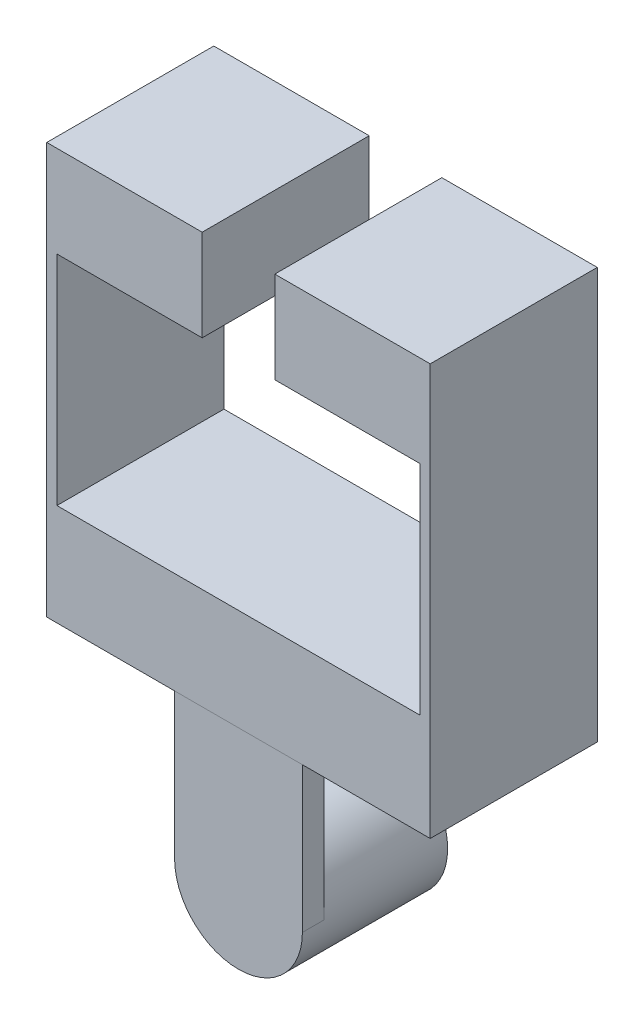
ISO-10303-21;
HEADER;
FILE_DESCRIPTION(('STEP AP214'),'2;1');
FILE_NAME('part.step','',(''),(''),'','','');
FILE_SCHEMA(('AUTOMOTIVE_DESIGN { 1 0 10303 214 1 1 1 1 }'));
ENDSEC;
DATA;
#1=APPLICATION_CONTEXT('core data for automotive mechanical design processes');
#2=APPLICATION_PROTOCOL_DEFINITION('international standard','automotive_design',2000,#1);
#3=PRODUCT_CONTEXT('',#1,'mechanical');
#4=PRODUCT('Part','Part','',(#3));
#5=PRODUCT_RELATED_PRODUCT_CATEGORY('part','',(#4));
#6=PRODUCT_DEFINITION_FORMATION('','',#4);
#7=PRODUCT_DEFINITION_CONTEXT('part definition',#1,'design');
#8=PRODUCT_DEFINITION('design','',#6,#7);
#9=PRODUCT_DEFINITION_SHAPE('','',#8);
#10=(LENGTH_UNIT() NAMED_UNIT(*) SI_UNIT(.MILLI.,.METRE.));
#11=(NAMED_UNIT(*) PLANE_ANGLE_UNIT() SI_UNIT($,.RADIAN.));
#12=(NAMED_UNIT(*) SI_UNIT($,.STERADIAN.) SOLID_ANGLE_UNIT());
#13=UNCERTAINTY_MEASURE_WITH_UNIT(LENGTH_MEASURE(1.E-05),#10,'distance_accuracy_value','');
#14=(GEOMETRIC_REPRESENTATION_CONTEXT(3) GLOBAL_UNCERTAINTY_ASSIGNED_CONTEXT((#13)) GLOBAL_UNIT_ASSIGNED_CONTEXT((#10,
#11,#12)) REPRESENTATION_CONTEXT('',''));
#15=CARTESIAN_POINT('',(0.,0.,0.));
#16=DIRECTION('',(0.,0.,1.));
#17=DIRECTION('',(1.,0.,0.));
#18=AXIS2_PLACEMENT_3D('',#15,#16,#17);
#19=CARTESIAN_POINT('',(0.,0.,29.21));
#20=DIRECTION('',(0.,0.,-1.));
#21=DIRECTION('',(-1.,0.,0.));
#22=AXIS2_PLACEMENT_3D('',#19,#20,#21);
#23=PLANE('',#22);
#24=DIRECTION('',(1.,0.,0.));
#25=VECTOR('',#24,1.);
#26=CARTESIAN_POINT('',(0.,-17.9340596383422,29.21));
#27=LINE('',#26,#25);
#28=CARTESIAN_POINT('',(-29.5693170731707,-17.9340596383422,29.21));
#29=VERTEX_POINT('',#28);
#30=CARTESIAN_POINT('',(-7.21731707317072,-17.9340596383422,29.21));
#31=VERTEX_POINT('',#30);
#32=EDGE_CURVE('E11',#29,#31,#27,.T.);
#33=ORIENTED_EDGE('',*,*,#32,.F.);
#34=DIRECTION('',(0.,-1.,0.));
#35=VECTOR('',#34,1.);
#36=CARTESIAN_POINT('',(-29.5693170731707,-17.9340596383422,29.21));
#37=LINE('',#36,#35);
#38=CARTESIAN_POINT('',(-29.5693170731707,-43.3340596383422,29.21));
#39=VERTEX_POINT('',#38);
#40=EDGE_CURVE('E273',#29,#39,#37,.T.);
#41=ORIENTED_EDGE('',*,*,#40,.T.);
#42=CARTESIAN_POINT('',(-18.3933170731707,-43.3340596383422,29.21));
#43=DIRECTION('',(0.,0.,1.));
#44=DIRECTION('',(1.,0.,0.));
#45=AXIS2_PLACEMENT_3D('',#42,#43,#44);
#46=CIRCLE('',#45,11.176);
#47=CARTESIAN_POINT('',(-7.21731707317072,-43.3340596383422,29.21));
#48=VERTEX_POINT('',#47);
#49=EDGE_CURVE('E342',#39,#48,#46,.T.);
#50=ORIENTED_EDGE('',*,*,#49,.T.);
#51=DIRECTION('',(0.,1.,0.));
#52=VECTOR('',#51,1.);
#53=CARTESIAN_POINT('',(-7.21731707317072,-43.3340596383422,29.21));
#54=LINE('',#53,#52);
#55=EDGE_CURVE('E269',#48,#31,#54,.T.);
#56=ORIENTED_EDGE('',*,*,#55,.T.);
#57=EDGE_LOOP('',(#33,#41,#50,#56));
#58=FACE_BOUND('',#57,.T.);
#59=ADVANCED_FACE('F47',(#58),#23,.F.);
#60=CARTESIAN_POINT('',(-51.9213170731707,-17.9340596383422,29.21));
#61=DIRECTION('',(0.,1.,0.));
#62=DIRECTION('',(-1.,0.,0.));
#63=AXIS2_PLACEMENT_3D('',#60,#61,#62);
#64=PLANE('',#63);
#65=DIRECTION('',(0.,0.,1.));
#66=VECTOR('',#65,1.);
#67=CARTESIAN_POINT('',(-7.21731707317072,-17.9340596383422,25.4));
#68=LINE('',#67,#66);
#69=CARTESIAN_POINT('',(-7.21731707317072,-17.9340596383422,25.4));
#70=VERTEX_POINT('',#69);
#71=EDGE_CURVE('E191',#70,#31,#68,.T.);
#72=ORIENTED_EDGE('',*,*,#71,.F.);
#73=DIRECTION('',(-1.,0.,0.));
#74=VECTOR('',#73,1.);
#75=CARTESIAN_POINT('',(-7.21731707317072,-17.9340596383422,25.4));
#76=LINE('',#75,#74);
#77=CARTESIAN_POINT('',(-29.5693170731707,-17.9340596383422,25.4));
#78=VERTEX_POINT('',#77);
#79=EDGE_CURVE('E270',#70,#78,#76,.T.);
#80=ORIENTED_EDGE('',*,*,#79,.T.);
#81=DIRECTION('',(0.,0.,1.));
#82=VECTOR('',#81,1.);
#83=CARTESIAN_POINT('',(-29.5693170731707,-17.9340596383422,25.4));
#84=LINE('',#83,#82);
#85=EDGE_CURVE('E266',#78,#29,#84,.T.);
#86=ORIENTED_EDGE('',*,*,#85,.T.);
#87=DIRECTION('',(1.,0.,0.));
#88=VECTOR('',#87,1.);
#89=CARTESIAN_POINT('',(-51.9213170731707,-17.9340596383422,29.21));
#90=LINE('',#89,#88);
#91=CARTESIAN_POINT('',(-51.9213170731707,-17.9340596383422,29.21));
#92=VERTEX_POINT('',#91);
#93=EDGE_CURVE('E187',#92,#29,#90,.T.);
#94=ORIENTED_EDGE('',*,*,#93,.F.);
#95=DIRECTION('',(0.,0.,-1.));
#96=VECTOR('',#95,1.);
#97=CARTESIAN_POINT('',(-51.9213170731707,-17.9340596383422,29.21));
#98=LINE('',#97,#96);
#99=CARTESIAN_POINT('',(-51.9213170731707,-17.9340596383422,0.));
#100=VERTEX_POINT('',#99);
#101=EDGE_CURVE('E75',#92,#100,#98,.T.);
#102=ORIENTED_EDGE('',*,*,#101,.T.);
#103=DIRECTION('',(1.,0.,0.));
#104=VECTOR('',#103,1.);
#105=CARTESIAN_POINT('',(-51.9213170731707,-17.9340596383422,0.));
#106=LINE('',#105,#104);
#107=CARTESIAN_POINT('',(15.1346829268293,-17.9340596383422,0.));
#108=VERTEX_POINT('',#107);
#109=EDGE_CURVE('E218',#100,#108,#106,.T.);
#110=ORIENTED_EDGE('',*,*,#109,.T.);
#111=DIRECTION('',(0.,0.,-1.));
#112=VECTOR('',#111,1.);
#113=CARTESIAN_POINT('',(15.1346829268293,-17.9340596383422,29.21));
#114=LINE('',#113,#112);
#115=CARTESIAN_POINT('',(15.1346829268293,-17.9340596383422,29.21));
#116=VERTEX_POINT('',#115);
#117=EDGE_CURVE('E164',#116,#108,#114,.T.);
#118=ORIENTED_EDGE('',*,*,#117,.F.);
#119=EDGE_CURVE('E179',#31,#116,#90,.T.);
#120=ORIENTED_EDGE('',*,*,#119,.F.);
#121=EDGE_LOOP('',(#72,#80,#86,#94,#102,#110,#118,#120));
#122=FACE_BOUND('',#121,.T.);
#123=ADVANCED_FACE('F335',(#122),#64,.F.);
#124=CARTESIAN_POINT('',(-51.9213170731707,-17.9340596383422,29.21));
#125=DIRECTION('',(-1.,0.,0.));
#126=DIRECTION('',(0.,0.,1.));
#127=AXIS2_PLACEMENT_3D('',#124,#125,#126);
#128=PLANE('',#127);
#129=DIRECTION('',(0.,1.,0.));
#130=VECTOR('',#129,1.);
#131=CARTESIAN_POINT('',(-51.9213170731707,-17.9340596383422,0.));
#132=LINE('',#131,#130);
#133=CARTESIAN_POINT('',(-51.9213170731707,53.9479403616578,0.));
#134=VERTEX_POINT('',#133);
#135=EDGE_CURVE('E188',#100,#134,#132,.T.);
#136=ORIENTED_EDGE('',*,*,#135,.F.);
#137=ORIENTED_EDGE('',*,*,#101,.F.);
#138=DIRECTION('',(0.,1.,0.));
#139=VECTOR('',#138,1.);
#140=CARTESIAN_POINT('',(-51.9213170731707,-17.9340596383422,29.21));
#141=LINE('',#140,#139);
#142=CARTESIAN_POINT('',(-51.9213170731707,53.9479403616578,29.21));
#143=VERTEX_POINT('',#142);
#144=EDGE_CURVE('E222',#92,#143,#141,.T.);
#145=ORIENTED_EDGE('',*,*,#144,.T.);
#146=DIRECTION('',(0.,0.,-1.));
#147=VECTOR('',#146,1.);
#148=CARTESIAN_POINT('',(-51.9213170731707,53.9479403616578,29.21));
#149=LINE('',#148,#147);
#150=EDGE_CURVE('E125',#143,#134,#149,.T.);
#151=ORIENTED_EDGE('',*,*,#150,.T.);
#152=EDGE_LOOP('',(#136,#137,#145,#151));
#153=FACE_BOUND('',#152,.T.);
#154=ADVANCED_FACE('F51',(#153),#128,.T.);
#155=CARTESIAN_POINT('',(15.1346829268293,53.9479403616578,29.21));
#156=DIRECTION('',(1.,0.,0.));
#157=DIRECTION('',(0.,1.,0.));
#158=AXIS2_PLACEMENT_3D('',#155,#156,#157);
#159=PLANE('',#158);
#160=DIRECTION('',(0.,-1.,0.));
#161=VECTOR('',#160,1.);
#162=CARTESIAN_POINT('',(15.1346829268293,53.9479403616578,0.));
#163=LINE('',#162,#161);
#164=CARTESIAN_POINT('',(15.1346829268293,53.9479403616578,0.));
#165=VERTEX_POINT('',#164);
#166=EDGE_CURVE('E159',#165,#108,#163,.T.);
#167=ORIENTED_EDGE('',*,*,#166,.F.);
#168=DIRECTION('',(0.,0.,-1.));
#169=VECTOR('',#168,1.);
#170=CARTESIAN_POINT('',(15.1346829268293,53.9479403616578,29.21));
#171=LINE('',#170,#169);
#172=CARTESIAN_POINT('',(15.1346829268293,53.9479403616578,29.21));
#173=VERTEX_POINT('',#172);
#174=EDGE_CURVE('E154',#173,#165,#171,.T.);
#175=ORIENTED_EDGE('',*,*,#174,.F.);
#176=DIRECTION('',(0.,-1.,0.));
#177=VECTOR('',#176,1.);
#178=CARTESIAN_POINT('',(15.1346829268293,53.9479403616578,29.21));
#179=LINE('',#178,#177);
#180=EDGE_CURVE('E158',#173,#116,#179,.T.);
#181=ORIENTED_EDGE('',*,*,#180,.T.);
#182=ORIENTED_EDGE('',*,*,#117,.T.);
#183=EDGE_LOOP('',(#167,#175,#181,#182));
#184=FACE_BOUND('',#183,.T.);
#185=ADVANCED_FACE('F160',(#184),#159,.T.);
#186=CARTESIAN_POINT('',(-12.0433170731707,53.9479403616578,29.21));
#187=DIRECTION('',(0.,1.,0.));
#188=DIRECTION('',(-1.,0.,0.));
#189=AXIS2_PLACEMENT_3D('',#186,#187,#188);
#190=PLANE('',#189);
#191=DIRECTION('',(1.,0.,0.));
#192=VECTOR('',#191,1.);
#193=CARTESIAN_POINT('',(-12.0433170731707,53.9479403616578,0.));
#194=LINE('',#193,#192);
#195=CARTESIAN_POINT('',(-12.0433170731707,53.9479403616578,0.));
#196=VERTEX_POINT('',#195);
#197=EDGE_CURVE('E216',#196,#165,#194,.T.);
#198=ORIENTED_EDGE('',*,*,#197,.F.);
#199=DIRECTION('',(0.,0.,-1.));
#200=VECTOR('',#199,1.);
#201=CARTESIAN_POINT('',(-12.0433170731707,53.9479403616578,29.21));
#202=LINE('',#201,#200);
#203=CARTESIAN_POINT('',(-12.0433170731707,53.9479403616578,29.21));
#204=VERTEX_POINT('',#203);
#205=EDGE_CURVE('E167',#204,#196,#202,.T.);
#206=ORIENTED_EDGE('',*,*,#205,.F.);
#207=DIRECTION('',(1.,0.,0.));
#208=VECTOR('',#207,1.);
#209=CARTESIAN_POINT('',(-12.0433170731707,53.9479403616578,29.21));
#210=LINE('',#209,#208);
#211=EDGE_CURVE('E173',#204,#173,#210,.T.);
#212=ORIENTED_EDGE('',*,*,#211,.T.);
#213=ORIENTED_EDGE('',*,*,#174,.T.);
#214=EDGE_LOOP('',(#198,#206,#212,#213));
#215=FACE_BOUND('',#214,.T.);
#216=ADVANCED_FACE('F178',(#215),#190,.T.);
#217=CARTESIAN_POINT('',(-12.0433170731707,37.9459403616578,29.21));
#218=DIRECTION('',(-1.,0.,0.));
#219=DIRECTION('',(0.,-1.,0.));
#220=AXIS2_PLACEMENT_3D('',#217,#218,#219);
#221=PLANE('',#220);
#222=DIRECTION('',(0.,1.,0.));
#223=VECTOR('',#222,1.);
#224=CARTESIAN_POINT('',(-12.0433170731707,37.9459403616578,0.));
#225=LINE('',#224,#223);
#226=CARTESIAN_POINT('',(-12.0433170731707,37.9459403616578,0.));
#227=VERTEX_POINT('',#226);
#228=EDGE_CURVE('E213',#227,#196,#225,.T.);
#229=ORIENTED_EDGE('',*,*,#228,.F.);
#230=DIRECTION('',(0.,0.,-1.));
#231=VECTOR('',#230,1.);
#232=CARTESIAN_POINT('',(-12.0433170731707,37.9459403616578,29.21));
#233=LINE('',#232,#231);
#234=CARTESIAN_POINT('',(-12.0433170731707,37.9459403616578,29.21));
#235=VERTEX_POINT('',#234);
#236=EDGE_CURVE('E223',#235,#227,#233,.T.);
#237=ORIENTED_EDGE('',*,*,#236,.F.);
#238=DIRECTION('',(0.,1.,0.));
#239=VECTOR('',#238,1.);
#240=CARTESIAN_POINT('',(-12.0433170731707,37.9459403616578,29.21));
#241=LINE('',#240,#239);
#242=EDGE_CURVE('E177',#235,#204,#241,.T.);
#243=ORIENTED_EDGE('',*,*,#242,.T.);
#244=ORIENTED_EDGE('',*,*,#205,.T.);
#245=EDGE_LOOP('',(#229,#237,#243,#244));
#246=FACE_BOUND('',#245,.T.);
#247=ADVANCED_FACE('F384',(#246),#221,.T.);
#248=CARTESIAN_POINT('',(13.3566829268293,37.9459403616578,29.21));
#249=DIRECTION('',(0.,-1.,0.));
#250=DIRECTION('',(0.,0.,-1.));
#251=AXIS2_PLACEMENT_3D('',#248,#249,#250);
#252=PLANE('',#251);
#253=DIRECTION('',(-1.,0.,0.));
#254=VECTOR('',#253,1.);
#255=CARTESIAN_POINT('',(13.3566829268293,37.9459403616578,0.));
#256=LINE('',#255,#254);
#257=CARTESIAN_POINT('',(13.3566829268293,37.9459403616578,0.));
#258=VERTEX_POINT('',#257);
#259=EDGE_CURVE('E209',#258,#227,#256,.T.);
#260=ORIENTED_EDGE('',*,*,#259,.F.);
#261=DIRECTION('',(0.,0.,-1.));
#262=VECTOR('',#261,1.);
#263=CARTESIAN_POINT('',(13.3566829268293,37.9459403616578,29.21));
#264=LINE('',#263,#262);
#265=CARTESIAN_POINT('',(13.3566829268293,37.9459403616578,29.21));
#266=VERTEX_POINT('',#265);
#267=EDGE_CURVE('E230',#266,#258,#264,.T.);
#268=ORIENTED_EDGE('',*,*,#267,.F.);
#269=DIRECTION('',(-1.,0.,0.));
#270=VECTOR('',#269,1.);
#271=CARTESIAN_POINT('',(13.3566829268293,37.9459403616578,29.21));
#272=LINE('',#271,#270);
#273=EDGE_CURVE('E185',#266,#235,#272,.T.);
#274=ORIENTED_EDGE('',*,*,#273,.T.);
#275=ORIENTED_EDGE('',*,*,#236,.T.);
#276=EDGE_LOOP('',(#260,#268,#274,#275));
#277=FACE_BOUND('',#276,.T.);
#278=ADVANCED_FACE('F302',(#277),#252,.T.);
#279=CARTESIAN_POINT('',(13.3566829268293,-0.154059638342201,29.21));
#280=DIRECTION('',(-1.,0.,0.));
#281=DIRECTION('',(0.,0.,1.));
#282=AXIS2_PLACEMENT_3D('',#279,#280,#281);
#283=PLANE('',#282);
#284=DIRECTION('',(0.,1.,0.));
#285=VECTOR('',#284,1.);
#286=CARTESIAN_POINT('',(13.3566829268293,-0.154059638342201,0.));
#287=LINE('',#286,#285);
#288=CARTESIAN_POINT('',(13.3566829268293,-0.154059638342201,0.));
#289=VERTEX_POINT('',#288);
#290=EDGE_CURVE('E210',#289,#258,#287,.T.);
#291=ORIENTED_EDGE('',*,*,#290,.F.);
#292=DIRECTION('',(0.,0.,-1.));
#293=VECTOR('',#292,1.);
#294=CARTESIAN_POINT('',(13.3566829268293,-0.154059638342201,29.21));
#295=LINE('',#294,#293);
#296=CARTESIAN_POINT('',(13.3566829268293,-0.154059638342201,29.21));
#297=VERTEX_POINT('',#296);
#298=EDGE_CURVE('E229',#297,#289,#295,.T.);
#299=ORIENTED_EDGE('',*,*,#298,.F.);
#300=DIRECTION('',(0.,1.,0.));
#301=VECTOR('',#300,1.);
#302=CARTESIAN_POINT('',(13.3566829268293,-0.154059638342201,29.21));
#303=LINE('',#302,#301);
#304=EDGE_CURVE('E299',#297,#266,#303,.T.);
#305=ORIENTED_EDGE('',*,*,#304,.T.);
#306=ORIENTED_EDGE('',*,*,#267,.T.);
#307=EDGE_LOOP('',(#291,#299,#305,#306));
#308=FACE_BOUND('',#307,.T.);
#309=ADVANCED_FACE('F313',(#308),#283,.T.);
#310=CARTESIAN_POINT('',(-50.1433170731707,-0.154059638342201,29.21));
#311=DIRECTION('',(0.,1.,0.));
#312=DIRECTION('',(0.,0.,1.));
#313=AXIS2_PLACEMENT_3D('',#310,#311,#312);
#314=PLANE('',#313);
#315=DIRECTION('',(1.,0.,0.));
#316=VECTOR('',#315,1.);
#317=CARTESIAN_POINT('',(-50.1433170731707,-0.154059638342201,0.));
#318=LINE('',#317,#316);
#319=CARTESIAN_POINT('',(-50.1433170731707,-0.154059638342201,0.));
#320=VERTEX_POINT('',#319);
#321=EDGE_CURVE('E204',#320,#289,#318,.T.);
#322=ORIENTED_EDGE('',*,*,#321,.F.);
#323=DIRECTION('',(0.,0.,-1.));
#324=VECTOR('',#323,1.);
#325=CARTESIAN_POINT('',(-50.1433170731707,-0.154059638342201,29.21));
#326=LINE('',#325,#324);
#327=CARTESIAN_POINT('',(-50.1433170731707,-0.154059638342201,29.21));
#328=VERTEX_POINT('',#327);
#329=EDGE_CURVE('E234',#328,#320,#326,.T.);
#330=ORIENTED_EDGE('',*,*,#329,.F.);
#331=DIRECTION('',(1.,0.,0.));
#332=VECTOR('',#331,1.);
#333=CARTESIAN_POINT('',(-50.1433170731707,-0.154059638342201,29.21));
#334=LINE('',#333,#332);
#335=EDGE_CURVE('E297',#328,#297,#334,.T.);
#336=ORIENTED_EDGE('',*,*,#335,.T.);
#337=ORIENTED_EDGE('',*,*,#298,.T.);
#338=EDGE_LOOP('',(#322,#330,#336,#337));
#339=FACE_BOUND('',#338,.T.);
#340=ADVANCED_FACE('F314',(#339),#314,.T.);
#341=CARTESIAN_POINT('',(-50.1433170731707,37.9459403616578,29.21));
#342=DIRECTION('',(1.,0.,0.));
#343=DIRECTION('',(0.,1.,0.));
#344=AXIS2_PLACEMENT_3D('',#341,#342,#343);
#345=PLANE('',#344);
#346=DIRECTION('',(0.,-1.,0.));
#347=VECTOR('',#346,1.);
#348=CARTESIAN_POINT('',(-50.1433170731707,37.9459403616578,0.));
#349=LINE('',#348,#347);
#350=CARTESIAN_POINT('',(-50.1433170731707,37.9459403616578,0.));
#351=VERTEX_POINT('',#350);
#352=EDGE_CURVE('E203',#351,#320,#349,.T.);
#353=ORIENTED_EDGE('',*,*,#352,.F.);
#354=DIRECTION('',(0.,0.,-1.));
#355=VECTOR('',#354,1.);
#356=CARTESIAN_POINT('',(-50.1433170731707,37.9459403616578,29.21));
#357=LINE('',#356,#355);
#358=CARTESIAN_POINT('',(-50.1433170731707,37.9459403616578,29.21));
#359=VERTEX_POINT('',#358);
#360=EDGE_CURVE('E235',#359,#351,#357,.T.);
#361=ORIENTED_EDGE('',*,*,#360,.F.);
#362=DIRECTION('',(0.,-1.,0.));
#363=VECTOR('',#362,1.);
#364=CARTESIAN_POINT('',(-50.1433170731707,37.9459403616578,29.21));
#365=LINE('',#364,#363);
#366=EDGE_CURVE('E291',#359,#328,#365,.T.);
#367=ORIENTED_EDGE('',*,*,#366,.T.);
#368=ORIENTED_EDGE('',*,*,#329,.T.);
#369=EDGE_LOOP('',(#353,#361,#367,#368));
#370=FACE_BOUND('',#369,.T.);
#371=ADVANCED_FACE('F317',(#370),#345,.T.);
#372=CARTESIAN_POINT('',(-24.7433170731707,37.9459403616578,29.21));
#373=DIRECTION('',(0.,-1.,0.));
#374=DIRECTION('',(1.,0.,0.));
#375=AXIS2_PLACEMENT_3D('',#372,#373,#374);
#376=PLANE('',#375);
#377=DIRECTION('',(-1.,0.,0.));
#378=VECTOR('',#377,1.);
#379=CARTESIAN_POINT('',(-24.7433170731707,37.9459403616578,0.));
#380=LINE('',#379,#378);
#381=CARTESIAN_POINT('',(-24.7433170731707,37.9459403616578,0.));
#382=VERTEX_POINT('',#381);
#383=EDGE_CURVE('E196',#382,#351,#380,.T.);
#384=ORIENTED_EDGE('',*,*,#383,.F.);
#385=DIRECTION('',(0.,0.,-1.));
#386=VECTOR('',#385,1.);
#387=CARTESIAN_POINT('',(-24.7433170731707,37.9459403616578,29.21));
#388=LINE('',#387,#386);
#389=CARTESIAN_POINT('',(-24.7433170731707,37.9459403616578,29.21));
#390=VERTEX_POINT('',#389);
#391=EDGE_CURVE('E232',#390,#382,#388,.T.);
#392=ORIENTED_EDGE('',*,*,#391,.F.);
#393=DIRECTION('',(-1.,0.,0.));
#394=VECTOR('',#393,1.);
#395=CARTESIAN_POINT('',(-24.7433170731707,37.9459403616578,29.21));
#396=LINE('',#395,#394);
#397=EDGE_CURVE('E287',#390,#359,#396,.T.);
#398=ORIENTED_EDGE('',*,*,#397,.T.);
#399=ORIENTED_EDGE('',*,*,#360,.T.);
#400=EDGE_LOOP('',(#384,#392,#398,#399));
#401=FACE_BOUND('',#400,.T.);
#402=ADVANCED_FACE('F325',(#401),#376,.T.);
#403=CARTESIAN_POINT('',(-24.7433170731707,53.9479403616578,29.21));
#404=DIRECTION('',(1.,0.,0.));
#405=DIRECTION('',(0.,0.,-1.));
#406=AXIS2_PLACEMENT_3D('',#403,#404,#405);
#407=PLANE('',#406);
#408=DIRECTION('',(0.,-1.,0.));
#409=VECTOR('',#408,1.);
#410=CARTESIAN_POINT('',(-24.7433170731707,53.9479403616578,0.));
#411=LINE('',#410,#409);
#412=CARTESIAN_POINT('',(-24.7433170731707,53.9479403616578,0.));
#413=VERTEX_POINT('',#412);
#414=EDGE_CURVE('E192',#413,#382,#411,.T.);
#415=ORIENTED_EDGE('',*,*,#414,.F.);
#416=DIRECTION('',(0.,0.,-1.));
#417=VECTOR('',#416,1.);
#418=CARTESIAN_POINT('',(-24.7433170731707,53.9479403616578,29.21));
#419=LINE('',#418,#417);
#420=CARTESIAN_POINT('',(-24.7433170731707,53.9479403616578,29.21));
#421=VERTEX_POINT('',#420);
#422=EDGE_CURVE('E240',#421,#413,#419,.T.);
#423=ORIENTED_EDGE('',*,*,#422,.F.);
#424=DIRECTION('',(0.,-1.,0.));
#425=VECTOR('',#424,1.);
#426=CARTESIAN_POINT('',(-24.7433170731707,53.9479403616578,29.21));
#427=LINE('',#426,#425);
#428=EDGE_CURVE('E286',#421,#390,#427,.T.);
#429=ORIENTED_EDGE('',*,*,#428,.T.);
#430=ORIENTED_EDGE('',*,*,#391,.T.);
#431=EDGE_LOOP('',(#415,#423,#429,#430));
#432=FACE_BOUND('',#431,.T.);
#433=ADVANCED_FACE('F326',(#432),#407,.T.);
#434=CARTESIAN_POINT('',(-51.9213170731707,53.9479403616578,29.21));
#435=DIRECTION('',(0.,1.,0.));
#436=DIRECTION('',(0.,0.,1.));
#437=AXIS2_PLACEMENT_3D('',#434,#435,#436);
#438=PLANE('',#437);
#439=DIRECTION('',(1.,0.,0.));
#440=VECTOR('',#439,1.);
#441=CARTESIAN_POINT('',(-51.9213170731707,53.9479403616578,0.));
#442=LINE('',#441,#440);
#443=EDGE_CURVE('E194',#134,#413,#442,.T.);
#444=ORIENTED_EDGE('',*,*,#443,.F.);
#445=ORIENTED_EDGE('',*,*,#150,.F.);
#446=DIRECTION('',(1.,0.,0.));
#447=VECTOR('',#446,1.);
#448=CARTESIAN_POINT('',(-51.9213170731707,53.9479403616578,29.21));
#449=LINE('',#448,#447);
#450=EDGE_CURVE('E281',#143,#421,#449,.T.);
#451=ORIENTED_EDGE('',*,*,#450,.T.);
#452=ORIENTED_EDGE('',*,*,#422,.T.);
#453=EDGE_LOOP('',(#444,#445,#451,#452));
#454=FACE_BOUND('',#453,.T.);
#455=ADVANCED_FACE('F330',(#454),#438,.T.);
#456=ORIENTED_EDGE('',*,*,#93,.T.);
#457=ORIENTED_EDGE('',*,*,#32,.T.);
#458=ORIENTED_EDGE('',*,*,#119,.T.);
#459=ORIENTED_EDGE('',*,*,#180,.F.);
#460=ORIENTED_EDGE('',*,*,#211,.F.);
#461=ORIENTED_EDGE('',*,*,#242,.F.);
#462=ORIENTED_EDGE('',*,*,#273,.F.);
#463=ORIENTED_EDGE('',*,*,#304,.F.);
#464=ORIENTED_EDGE('',*,*,#335,.F.);
#465=ORIENTED_EDGE('',*,*,#366,.F.);
#466=ORIENTED_EDGE('',*,*,#397,.F.);
#467=ORIENTED_EDGE('',*,*,#428,.F.);
#468=ORIENTED_EDGE('',*,*,#450,.F.);
#469=ORIENTED_EDGE('',*,*,#144,.F.);
#470=EDGE_LOOP('',(#456,#457,#458,#459,#460,#461,#462,#463,#464,#465,#466,#467,#468,#469));
#471=FACE_BOUND('',#470,.T.);
#472=ADVANCED_FACE('F172',(#471),#23,.F.);
#473=CARTESIAN_POINT('',(0.,0.,0.));
#474=DIRECTION('',(0.,0.,-1.));
#475=DIRECTION('',(-1.,0.,0.));
#476=AXIS2_PLACEMENT_3D('',#473,#474,#475);
#477=PLANE('',#476);
#478=ORIENTED_EDGE('',*,*,#135,.T.);
#479=ORIENTED_EDGE('',*,*,#443,.T.);
#480=ORIENTED_EDGE('',*,*,#414,.T.);
#481=ORIENTED_EDGE('',*,*,#383,.T.);
#482=ORIENTED_EDGE('',*,*,#352,.T.);
#483=ORIENTED_EDGE('',*,*,#321,.T.);
#484=ORIENTED_EDGE('',*,*,#290,.T.);
#485=ORIENTED_EDGE('',*,*,#259,.T.);
#486=ORIENTED_EDGE('',*,*,#228,.T.);
#487=ORIENTED_EDGE('',*,*,#197,.T.);
#488=ORIENTED_EDGE('',*,*,#166,.T.);
#489=ORIENTED_EDGE('',*,*,#109,.F.);
#490=EDGE_LOOP('',(#478,#479,#480,#481,#482,#483,#484,#485,#486,#487,#488,#489));
#491=FACE_BOUND('',#490,.T.);
#492=ADVANCED_FACE('F329',(#491),#477,.T.);
#493=CARTESIAN_POINT('',(-7.21731707317072,-43.3340596383422,25.4));
#494=DIRECTION('',(1.,0.,0.));
#495=DIRECTION('',(0.,1.,0.));
#496=AXIS2_PLACEMENT_3D('',#493,#494,#495);
#497=PLANE('',#496);
#498=ORIENTED_EDGE('',*,*,#55,.F.);
#499=DIRECTION('',(0.,0.,1.));
#500=VECTOR('',#499,1.);
#501=CARTESIAN_POINT('',(-7.21731707317072,-43.3340596383422,25.4));
#502=LINE('',#501,#500);
#503=CARTESIAN_POINT('',(-7.21731707317072,-43.3340596383422,25.4));
#504=VERTEX_POINT('',#503);
#505=EDGE_CURVE('E278',#504,#48,#502,.T.);
#506=ORIENTED_EDGE('',*,*,#505,.F.);
#507=DIRECTION('',(0.,1.,0.));
#508=VECTOR('',#507,1.);
#509=CARTESIAN_POINT('',(-7.21731707317072,-43.3340596383422,25.4));
#510=LINE('',#509,#508);
#511=EDGE_CURVE('E251',#504,#70,#510,.T.);
#512=ORIENTED_EDGE('',*,*,#511,.T.);
#513=ORIENTED_EDGE('',*,*,#71,.T.);
#514=EDGE_LOOP('',(#498,#506,#512,#513));
#515=FACE_BOUND('',#514,.T.);
#516=ADVANCED_FACE('F344',(#515),#497,.T.);
#517=CARTESIAN_POINT('',(-29.5693170731707,-17.9340596383422,25.4));
#518=DIRECTION('',(-1.,0.,0.));
#519=DIRECTION('',(0.,-1.,0.));
#520=AXIS2_PLACEMENT_3D('',#517,#518,#519);
#521=PLANE('',#520);
#522=ORIENTED_EDGE('',*,*,#40,.F.);
#523=ORIENTED_EDGE('',*,*,#85,.F.);
#524=DIRECTION('',(0.,-1.,0.));
#525=VECTOR('',#524,1.);
#526=CARTESIAN_POINT('',(-29.5693170731707,-17.9340596383422,25.4));
#527=LINE('',#526,#525);
#528=CARTESIAN_POINT('',(-29.5693170731707,-43.3340596383422,25.4));
#529=VERTEX_POINT('',#528);
#530=EDGE_CURVE('E248',#78,#529,#527,.T.);
#531=ORIENTED_EDGE('',*,*,#530,.T.);
#532=DIRECTION('',(0.,0.,1.));
#533=VECTOR('',#532,1.);
#534=CARTESIAN_POINT('',(-29.5693170731707,-43.3340596383422,25.4));
#535=LINE('',#534,#533);
#536=EDGE_CURVE('E262',#529,#39,#535,.T.);
#537=ORIENTED_EDGE('',*,*,#536,.T.);
#538=EDGE_LOOP('',(#522,#523,#531,#537));
#539=FACE_BOUND('',#538,.T.);
#540=ADVANCED_FACE('F265',(#539),#521,.T.);
#541=CARTESIAN_POINT('',(0.,0.,25.4));
#542=DIRECTION('',(0.,0.,1.));
#543=DIRECTION('',(1.,0.,0.));
#544=AXIS2_PLACEMENT_3D('',#541,#542,#543);
#545=PLANE('',#544);
#546=ORIENTED_EDGE('',*,*,#511,.F.);
#547=CARTESIAN_POINT('',(-18.3933170731707,-43.3340596383422,25.4));
#548=DIRECTION('',(0.,0.,1.));
#549=DIRECTION('',(1.,0.,0.));
#550=AXIS2_PLACEMENT_3D('',#547,#548,#549);
#551=CIRCLE('',#550,11.176);
#552=EDGE_CURVE('E59',#504,#529,#551,.T.);
#553=ORIENTED_EDGE('',*,*,#552,.T.);
#554=ORIENTED_EDGE('',*,*,#530,.F.);
#555=ORIENTED_EDGE('',*,*,#79,.F.);
#556=EDGE_LOOP('',(#546,#553,#554,#555));
#557=FACE_BOUND('',#556,.T.);
#558=ADVANCED_FACE('F249',(#557),#545,.F.);
#559=CARTESIAN_POINT('',(-18.3933170731707,-43.3340596383422,3.81));
#560=DIRECTION('',(0.,0.,1.));
#561=DIRECTION('',(1.,0.,0.));
#562=AXIS2_PLACEMENT_3D('',#559,#560,#561);
#563=CYLINDRICAL_SURFACE('',#562,11.176);
#564=ORIENTED_EDGE('',*,*,#552,.F.);
#565=ORIENTED_EDGE('',*,*,#505,.T.);
#566=ORIENTED_EDGE('',*,*,#49,.F.);
#567=ORIENTED_EDGE('',*,*,#536,.F.);
#568=EDGE_LOOP('',(#564,#565,#566,#567));
#569=FACE_BOUND('',#568,.T.);
#570=CARTESIAN_POINT('',(-18.3933170731707,-43.3340596383422,3.81));
#571=DIRECTION('',(0.,0.,1.));
#572=DIRECTION('',(1.,0.,0.));
#573=AXIS2_PLACEMENT_3D('',#570,#571,#572);
#574=CIRCLE('',#573,11.176);
#575=CARTESIAN_POINT('',(-7.21731707317072,-43.3340596383422,3.81));
#576=VERTEX_POINT('',#575);
#577=EDGE_CURVE('E277',#576,#576,#574,.T.);
#578=ORIENTED_EDGE('',*,*,#577,.T.);
#579=EDGE_LOOP('',(#578));
#580=FACE_BOUND('',#579,.T.);
#581=ADVANCED_FACE('F345',(#569,#580),#563,.T.);
#582=CARTESIAN_POINT('',(-18.3933170731707,-43.3340596383422,3.81));
#583=DIRECTION('',(0.,0.,1.));
#584=DIRECTION('',(1.,0.,0.));
#585=AXIS2_PLACEMENT_3D('',#582,#583,#584);
#586=PLANE('',#585);
#587=ORIENTED_EDGE('',*,*,#577,.F.);
#588=EDGE_LOOP('',(#587));
#589=FACE_BOUND('',#588,.T.);
#590=ADVANCED_FACE('F348',(#589),#586,.F.);
#591=CLOSED_SHELL('',(#59,#123,#154,#185,#216,#247,#278,#309,#340,#371,#402,#433,#455,#472,#492,
#516,#540,#558,#581,#590));
#592=MANIFOLD_SOLID_BREP('B2',#591);
#593=ADVANCED_BREP_SHAPE_REPRESENTATION('',(#18,#592),#14);
#594=SHAPE_DEFINITION_REPRESENTATION(#9,#593);
ENDSEC;
END-ISO-10303-21;
